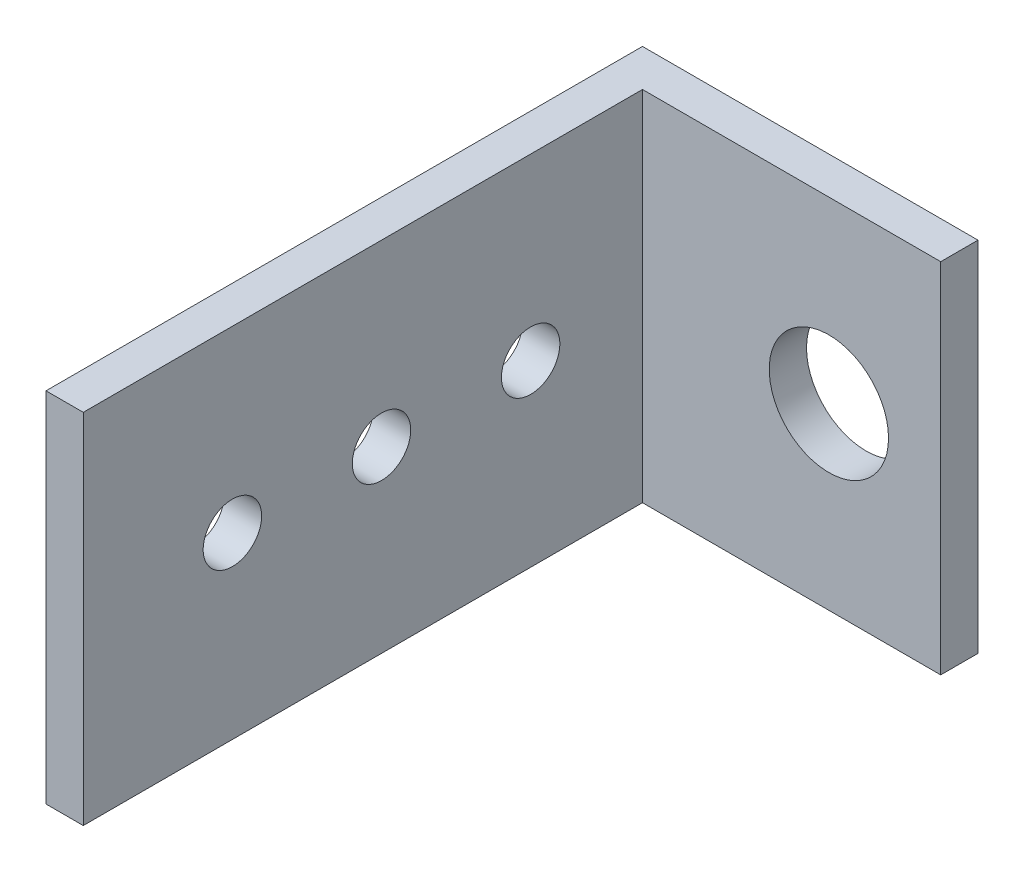
ISO-10303-21;
HEADER;
FILE_DESCRIPTION(('STEP AP214'),'2;1');
FILE_NAME('part.step','',(''),(''),'','','');
FILE_SCHEMA(('AUTOMOTIVE_DESIGN { 1 0 10303 214 1 1 1 1 }'));
ENDSEC;
DATA;
#1=APPLICATION_CONTEXT('core data for automotive mechanical design processes');
#2=APPLICATION_PROTOCOL_DEFINITION('international standard','automotive_design',2000,#1);
#3=PRODUCT_CONTEXT('',#1,'mechanical');
#4=PRODUCT('Part','Part','',(#3));
#5=PRODUCT_RELATED_PRODUCT_CATEGORY('part','',(#4));
#6=PRODUCT_DEFINITION_FORMATION('','',#4);
#7=PRODUCT_DEFINITION_CONTEXT('part definition',#1,'design');
#8=PRODUCT_DEFINITION('design','',#6,#7);
#9=PRODUCT_DEFINITION_SHAPE('','',#8);
#10=(LENGTH_UNIT() NAMED_UNIT(*) SI_UNIT(.MILLI.,.METRE.));
#11=(NAMED_UNIT(*) PLANE_ANGLE_UNIT() SI_UNIT($,.RADIAN.));
#12=(NAMED_UNIT(*) SI_UNIT($,.STERADIAN.) SOLID_ANGLE_UNIT());
#13=UNCERTAINTY_MEASURE_WITH_UNIT(LENGTH_MEASURE(1.E-05),#10,'distance_accuracy_value','');
#14=(GEOMETRIC_REPRESENTATION_CONTEXT(3) GLOBAL_UNCERTAINTY_ASSIGNED_CONTEXT((#13)) GLOBAL_UNIT_ASSIGNED_CONTEXT((#10,
#11,#12)) REPRESENTATION_CONTEXT('',''));
#15=CARTESIAN_POINT('',(0.,0.,0.));
#16=DIRECTION('',(0.,0.,1.));
#17=DIRECTION('',(1.,0.,0.));
#18=AXIS2_PLACEMENT_3D('',#15,#16,#17);
#19=CARTESIAN_POINT('',(3.175,30.48,0.));
#20=DIRECTION('',(-1.,0.,0.));
#21=DIRECTION('',(0.,0.,1.));
#22=AXIS2_PLACEMENT_3D('',#19,#20,#21);
#23=PLANE('',#22);
#24=CARTESIAN_POINT('',(3.175,15.24,-12.7));
#25=DIRECTION('',(1.,0.,0.));
#26=DIRECTION('',(0.,0.,-1.));
#27=AXIS2_PLACEMENT_3D('',#24,#25,#26);
#28=CIRCLE('',#27,2.4892);
#29=CARTESIAN_POINT('',(3.175,15.24,-15.1892));
#30=VERTEX_POINT('',#29);
#31=EDGE_CURVE('E175',#30,#30,#28,.T.);
#32=ORIENTED_EDGE('',*,*,#31,.F.);
#33=EDGE_LOOP('',(#32));
#34=FACE_BOUND('',#33,.T.);
#35=CARTESIAN_POINT('',(3.175,15.24,-25.4));
#36=DIRECTION('',(1.,0.,0.));
#37=DIRECTION('',(0.,0.,-1.));
#38=AXIS2_PLACEMENT_3D('',#35,#36,#37);
#39=CIRCLE('',#38,2.4892);
#40=CARTESIAN_POINT('',(3.175,15.24,-27.8892));
#41=VERTEX_POINT('',#40);
#42=EDGE_CURVE('E232',#41,#41,#39,.T.);
#43=ORIENTED_EDGE('',*,*,#42,.F.);
#44=EDGE_LOOP('',(#43));
#45=FACE_BOUND('',#44,.T.);
#46=CARTESIAN_POINT('',(3.175,15.24,-38.1));
#47=DIRECTION('',(1.,0.,0.));
#48=DIRECTION('',(0.,0.,-1.));
#49=AXIS2_PLACEMENT_3D('',#46,#47,#48);
#50=CIRCLE('',#49,2.4892);
#51=CARTESIAN_POINT('',(3.175,15.24,-40.5892));
#52=VERTEX_POINT('',#51);
#53=EDGE_CURVE('E191',#52,#52,#50,.T.);
#54=ORIENTED_EDGE('',*,*,#53,.F.);
#55=EDGE_LOOP('',(#54));
#56=FACE_BOUND('',#55,.T.);
#57=DIRECTION('',(0.,0.,-1.));
#58=VECTOR('',#57,1.);
#59=CARTESIAN_POINT('',(3.175,0.,0.));
#60=LINE('',#59,#58);
#61=CARTESIAN_POINT('',(3.175,0.,0.));
#62=VERTEX_POINT('',#61);
#63=CARTESIAN_POINT('',(3.175,0.,-47.625));
#64=VERTEX_POINT('',#63);
#65=EDGE_CURVE('E138',#62,#64,#60,.T.);
#66=ORIENTED_EDGE('',*,*,#65,.T.);
#67=DIRECTION('',(0.,-1.,0.));
#68=VECTOR('',#67,1.);
#69=CARTESIAN_POINT('',(3.175,30.48,-47.625));
#70=LINE('',#69,#68);
#71=CARTESIAN_POINT('',(3.175,30.48,-47.625));
#72=VERTEX_POINT('',#71);
#73=EDGE_CURVE('E11',#72,#64,#70,.T.);
#74=ORIENTED_EDGE('',*,*,#73,.F.);
#75=DIRECTION('',(0.,0.,-1.));
#76=VECTOR('',#75,1.);
#77=CARTESIAN_POINT('',(3.175,30.48,0.));
#78=LINE('',#77,#76);
#79=CARTESIAN_POINT('',(3.175,30.48,0.));
#80=VERTEX_POINT('',#79);
#81=EDGE_CURVE('E158',#80,#72,#78,.T.);
#82=ORIENTED_EDGE('',*,*,#81,.F.);
#83=DIRECTION('',(0.,-1.,0.));
#84=VECTOR('',#83,1.);
#85=CARTESIAN_POINT('',(3.175,30.48,0.));
#86=LINE('',#85,#84);
#87=EDGE_CURVE('E134',#80,#62,#86,.T.);
#88=ORIENTED_EDGE('',*,*,#87,.T.);
#89=EDGE_LOOP('',(#66,#74,#82,#88));
#90=FACE_BOUND('',#89,.T.);
#91=ADVANCED_FACE('F49',(#34,#45,#56,#90),#23,.F.);
#92=CARTESIAN_POINT('',(0.,30.48,-47.625));
#93=DIRECTION('',(0.,0.,-1.));
#94=DIRECTION('',(-1.,0.,0.));
#95=AXIS2_PLACEMENT_3D('',#92,#93,#94);
#96=PLANE('',#95);
#97=CARTESIAN_POINT('',(19.05,15.24,-47.625));
#98=DIRECTION('',(0.,0.,1.));
#99=DIRECTION('',(1.,0.,0.));
#100=AXIS2_PLACEMENT_3D('',#97,#98,#99);
#101=CIRCLE('',#100,5.08);
#102=CARTESIAN_POINT('',(24.13,15.24,-47.625));
#103=VERTEX_POINT('',#102);
#104=EDGE_CURVE('E170',#103,#103,#101,.T.);
#105=ORIENTED_EDGE('',*,*,#104,.F.);
#106=EDGE_LOOP('',(#105));
#107=FACE_BOUND('',#106,.T.);
#108=DIRECTION('',(1.,0.,0.));
#109=VECTOR('',#108,1.);
#110=CARTESIAN_POINT('',(0.,0.,-47.625));
#111=LINE('',#110,#109);
#112=CARTESIAN_POINT('',(28.575,0.,-47.625));
#113=VERTEX_POINT('',#112);
#114=EDGE_CURVE('E142',#64,#113,#111,.T.);
#115=ORIENTED_EDGE('',*,*,#114,.T.);
#116=DIRECTION('',(0.,-1.,0.));
#117=VECTOR('',#116,1.);
#118=CARTESIAN_POINT('',(28.575,30.48,-47.625));
#119=LINE('',#118,#117);
#120=CARTESIAN_POINT('',(28.575,30.48,-47.625));
#121=VERTEX_POINT('',#120);
#122=EDGE_CURVE('E59',#121,#113,#119,.T.);
#123=ORIENTED_EDGE('',*,*,#122,.F.);
#124=DIRECTION('',(1.,0.,0.));
#125=VECTOR('',#124,1.);
#126=CARTESIAN_POINT('',(0.,30.48,-47.625));
#127=LINE('',#126,#125);
#128=EDGE_CURVE('E101',#72,#121,#127,.T.);
#129=ORIENTED_EDGE('',*,*,#128,.F.);
#130=ORIENTED_EDGE('',*,*,#73,.T.);
#131=EDGE_LOOP('',(#115,#123,#129,#130));
#132=FACE_BOUND('',#131,.T.);
#133=ADVANCED_FACE('F219',(#107,#132),#96,.F.);
#134=CARTESIAN_POINT('',(28.5750000000001,30.48,0.));
#135=DIRECTION('',(1.,0.,0.));
#136=DIRECTION('',(0.,0.,-1.));
#137=AXIS2_PLACEMENT_3D('',#134,#135,#136);
#138=PLANE('',#137);
#139=DIRECTION('',(0.,0.,1.));
#140=VECTOR('',#139,1.);
#141=CARTESIAN_POINT('',(28.5750000000001,0.,0.));
#142=LINE('',#141,#140);
#143=CARTESIAN_POINT('',(28.575,0.,-50.8));
#144=VERTEX_POINT('',#143);
#145=EDGE_CURVE('E147',#144,#113,#142,.T.);
#146=ORIENTED_EDGE('',*,*,#145,.F.);
#147=DIRECTION('',(0.,-1.,0.));
#148=VECTOR('',#147,1.);
#149=CARTESIAN_POINT('',(28.575,30.48,-50.8));
#150=LINE('',#149,#148);
#151=CARTESIAN_POINT('',(28.575,30.48,-50.8));
#152=VERTEX_POINT('',#151);
#153=EDGE_CURVE('E121',#152,#144,#150,.T.);
#154=ORIENTED_EDGE('',*,*,#153,.F.);
#155=DIRECTION('',(0.,0.,1.));
#156=VECTOR('',#155,1.);
#157=CARTESIAN_POINT('',(28.5750000000001,30.48,0.));
#158=LINE('',#157,#156);
#159=EDGE_CURVE('E127',#152,#121,#158,.T.);
#160=ORIENTED_EDGE('',*,*,#159,.T.);
#161=ORIENTED_EDGE('',*,*,#122,.T.);
#162=EDGE_LOOP('',(#146,#154,#160,#161));
#163=FACE_BOUND('',#162,.T.);
#164=ADVANCED_FACE('F199',(#163),#138,.T.);
#165=CARTESIAN_POINT('',(0.,30.48,-50.8));
#166=DIRECTION('',(0.,0.,-1.));
#167=DIRECTION('',(-1.,0.,0.));
#168=AXIS2_PLACEMENT_3D('',#165,#166,#167);
#169=PLANE('',#168);
#170=CARTESIAN_POINT('',(19.05,15.24,-50.8));
#171=DIRECTION('',(0.,0.,-1.));
#172=DIRECTION('',(-1.,0.,0.));
#173=AXIS2_PLACEMENT_3D('',#170,#171,#172);
#174=CIRCLE('',#173,5.08);
#175=CARTESIAN_POINT('',(13.97,15.24,-50.8));
#176=VERTEX_POINT('',#175);
#177=EDGE_CURVE('E143',#176,#176,#174,.T.);
#178=ORIENTED_EDGE('',*,*,#177,.F.);
#179=EDGE_LOOP('',(#178));
#180=FACE_BOUND('',#179,.T.);
#181=DIRECTION('',(1.,0.,0.));
#182=VECTOR('',#181,1.);
#183=CARTESIAN_POINT('',(0.,0.,-50.8));
#184=LINE('',#183,#182);
#185=CARTESIAN_POINT('',(0.,0.,-50.8));
#186=VERTEX_POINT('',#185);
#187=EDGE_CURVE('E115',#186,#144,#184,.T.);
#188=ORIENTED_EDGE('',*,*,#187,.F.);
#189=DIRECTION('',(0.,-1.,0.));
#190=VECTOR('',#189,1.);
#191=CARTESIAN_POINT('',(0.,30.48,-50.8));
#192=LINE('',#191,#190);
#193=CARTESIAN_POINT('',(0.,30.48,-50.8));
#194=VERTEX_POINT('',#193);
#195=EDGE_CURVE('E110',#194,#186,#192,.T.);
#196=ORIENTED_EDGE('',*,*,#195,.F.);
#197=DIRECTION('',(1.,0.,0.));
#198=VECTOR('',#197,1.);
#199=CARTESIAN_POINT('',(0.,30.48,-50.8));
#200=LINE('',#199,#198);
#201=EDGE_CURVE('E113',#194,#152,#200,.T.);
#202=ORIENTED_EDGE('',*,*,#201,.T.);
#203=ORIENTED_EDGE('',*,*,#153,.T.);
#204=EDGE_LOOP('',(#188,#196,#202,#203));
#205=FACE_BOUND('',#204,.T.);
#206=ADVANCED_FACE('F112',(#180,#205),#169,.T.);
#207=CARTESIAN_POINT('',(0.,30.48,0.));
#208=DIRECTION('',(-1.,0.,0.));
#209=DIRECTION('',(0.,0.,1.));
#210=AXIS2_PLACEMENT_3D('',#207,#208,#209);
#211=PLANE('',#210);
#212=CARTESIAN_POINT('',(0.,15.24,-12.7));
#213=DIRECTION('',(-1.,0.,0.));
#214=DIRECTION('',(0.,0.,1.));
#215=AXIS2_PLACEMENT_3D('',#212,#213,#214);
#216=CIRCLE('',#215,2.4892);
#217=CARTESIAN_POINT('',(0.,15.24,-10.2108));
#218=VERTEX_POINT('',#217);
#219=EDGE_CURVE('E52',#218,#218,#216,.T.);
#220=ORIENTED_EDGE('',*,*,#219,.F.);
#221=EDGE_LOOP('',(#220));
#222=FACE_BOUND('',#221,.T.);
#223=CARTESIAN_POINT('',(0.,15.24,-25.4));
#224=DIRECTION('',(-1.,0.,0.));
#225=DIRECTION('',(0.,0.,1.));
#226=AXIS2_PLACEMENT_3D('',#223,#224,#225);
#227=CIRCLE('',#226,2.4892);
#228=CARTESIAN_POINT('',(0.,15.24,-22.9108));
#229=VERTEX_POINT('',#228);
#230=EDGE_CURVE('E174',#229,#229,#227,.T.);
#231=ORIENTED_EDGE('',*,*,#230,.F.);
#232=EDGE_LOOP('',(#231));
#233=FACE_BOUND('',#232,.T.);
#234=CARTESIAN_POINT('',(0.,15.24,-38.1));
#235=DIRECTION('',(-1.,0.,0.));
#236=DIRECTION('',(0.,0.,1.));
#237=AXIS2_PLACEMENT_3D('',#234,#235,#236);
#238=CIRCLE('',#237,2.4892);
#239=CARTESIAN_POINT('',(0.,15.24,-35.6108));
#240=VERTEX_POINT('',#239);
#241=EDGE_CURVE('E171',#240,#240,#238,.T.);
#242=ORIENTED_EDGE('',*,*,#241,.F.);
#243=EDGE_LOOP('',(#242));
#244=FACE_BOUND('',#243,.T.);
#245=DIRECTION('',(0.,0.,-1.));
#246=VECTOR('',#245,1.);
#247=CARTESIAN_POINT('',(0.,0.,0.));
#248=LINE('',#247,#246);
#249=CARTESIAN_POINT('',(0.,0.,0.));
#250=VERTEX_POINT('',#249);
#251=EDGE_CURVE('E153',#250,#186,#248,.T.);
#252=ORIENTED_EDGE('',*,*,#251,.F.);
#253=DIRECTION('',(0.,-1.,0.));
#254=VECTOR('',#253,1.);
#255=CARTESIAN_POINT('',(0.,30.48,0.));
#256=LINE('',#255,#254);
#257=CARTESIAN_POINT('',(0.,30.48,0.));
#258=VERTEX_POINT('',#257);
#259=EDGE_CURVE('E90',#258,#250,#256,.T.);
#260=ORIENTED_EDGE('',*,*,#259,.F.);
#261=DIRECTION('',(0.,0.,-1.));
#262=VECTOR('',#261,1.);
#263=CARTESIAN_POINT('',(0.,30.48,0.));
#264=LINE('',#263,#262);
#265=EDGE_CURVE('E125',#258,#194,#264,.T.);
#266=ORIENTED_EDGE('',*,*,#265,.T.);
#267=ORIENTED_EDGE('',*,*,#195,.T.);
#268=EDGE_LOOP('',(#252,#260,#266,#267));
#269=FACE_BOUND('',#268,.T.);
#270=ADVANCED_FACE('F130',(#222,#233,#244,#269),#211,.T.);
#271=CARTESIAN_POINT('',(0.,30.48,0.));
#272=DIRECTION('',(0.,0.,-1.));
#273=DIRECTION('',(-1.,0.,0.));
#274=AXIS2_PLACEMENT_3D('',#271,#272,#273);
#275=PLANE('',#274);
#276=DIRECTION('',(1.,0.,0.));
#277=VECTOR('',#276,1.);
#278=CARTESIAN_POINT('',(0.,0.,0.));
#279=LINE('',#278,#277);
#280=EDGE_CURVE('E93',#250,#62,#279,.T.);
#281=ORIENTED_EDGE('',*,*,#280,.T.);
#282=ORIENTED_EDGE('',*,*,#87,.F.);
#283=DIRECTION('',(1.,0.,0.));
#284=VECTOR('',#283,1.);
#285=CARTESIAN_POINT('',(0.,30.48,0.));
#286=LINE('',#285,#284);
#287=EDGE_CURVE('E68',#258,#80,#286,.T.);
#288=ORIENTED_EDGE('',*,*,#287,.F.);
#289=ORIENTED_EDGE('',*,*,#259,.T.);
#290=EDGE_LOOP('',(#281,#282,#288,#289));
#291=FACE_BOUND('',#290,.T.);
#292=ADVANCED_FACE('F206',(#291),#275,.F.);
#293=CARTESIAN_POINT('',(0.,30.48,0.));
#294=DIRECTION('',(0.,1.,0.));
#295=DIRECTION('',(0.,0.,1.));
#296=AXIS2_PLACEMENT_3D('',#293,#294,#295);
#297=PLANE('',#296);
#298=ORIENTED_EDGE('',*,*,#81,.T.);
#299=ORIENTED_EDGE('',*,*,#128,.T.);
#300=ORIENTED_EDGE('',*,*,#159,.F.);
#301=ORIENTED_EDGE('',*,*,#201,.F.);
#302=ORIENTED_EDGE('',*,*,#265,.F.);
#303=ORIENTED_EDGE('',*,*,#287,.T.);
#304=EDGE_LOOP('',(#298,#299,#300,#301,#302,#303));
#305=FACE_BOUND('',#304,.T.);
#306=ADVANCED_FACE('F124',(#305),#297,.T.);
#307=CARTESIAN_POINT('',(0.,0.,0.));
#308=DIRECTION('',(0.,1.,0.));
#309=DIRECTION('',(0.,0.,1.));
#310=AXIS2_PLACEMENT_3D('',#307,#308,#309);
#311=PLANE('',#310);
#312=ORIENTED_EDGE('',*,*,#65,.F.);
#313=ORIENTED_EDGE('',*,*,#280,.F.);
#314=ORIENTED_EDGE('',*,*,#251,.T.);
#315=ORIENTED_EDGE('',*,*,#187,.T.);
#316=ORIENTED_EDGE('',*,*,#145,.T.);
#317=ORIENTED_EDGE('',*,*,#114,.F.);
#318=EDGE_LOOP('',(#312,#313,#314,#315,#316,#317));
#319=FACE_BOUND('',#318,.T.);
#320=ADVANCED_FACE('F202',(#319),#311,.F.);
#321=CARTESIAN_POINT('',(19.05,15.24,-80.391));
#322=DIRECTION('',(0.,0.,1.));
#323=DIRECTION('',(1.,0.,0.));
#324=AXIS2_PLACEMENT_3D('',#321,#322,#323);
#325=CYLINDRICAL_SURFACE('',#324,5.08);
#326=ORIENTED_EDGE('',*,*,#177,.T.);
#327=EDGE_LOOP('',(#326));
#328=FACE_BOUND('',#327,.T.);
#329=ORIENTED_EDGE('',*,*,#104,.T.);
#330=EDGE_LOOP('',(#329));
#331=FACE_BOUND('',#330,.T.);
#332=ADVANCED_FACE('F254',(#328,#331),#325,.F.);
#333=CARTESIAN_POINT('',(-29.591,15.24,-38.1));
#334=DIRECTION('',(1.,0.,0.));
#335=DIRECTION('',(0.,0.,-1.));
#336=AXIS2_PLACEMENT_3D('',#333,#334,#335);
#337=CYLINDRICAL_SURFACE('',#336,2.4892);
#338=ORIENTED_EDGE('',*,*,#241,.T.);
#339=EDGE_LOOP('',(#338));
#340=FACE_BOUND('',#339,.T.);
#341=ORIENTED_EDGE('',*,*,#53,.T.);
#342=EDGE_LOOP('',(#341));
#343=FACE_BOUND('',#342,.T.);
#344=ADVANCED_FACE('F249',(#340,#343),#337,.F.);
#345=CARTESIAN_POINT('',(-29.591,15.24,-25.4));
#346=DIRECTION('',(1.,0.,0.));
#347=DIRECTION('',(0.,0.,-1.));
#348=AXIS2_PLACEMENT_3D('',#345,#346,#347);
#349=CYLINDRICAL_SURFACE('',#348,2.4892);
#350=ORIENTED_EDGE('',*,*,#230,.T.);
#351=EDGE_LOOP('',(#350));
#352=FACE_BOUND('',#351,.T.);
#353=ORIENTED_EDGE('',*,*,#42,.T.);
#354=EDGE_LOOP('',(#353));
#355=FACE_BOUND('',#354,.T.);
#356=ADVANCED_FACE('F244',(#352,#355),#349,.F.);
#357=CARTESIAN_POINT('',(-29.591,15.24,-12.7));
#358=DIRECTION('',(1.,0.,0.));
#359=DIRECTION('',(0.,0.,-1.));
#360=AXIS2_PLACEMENT_3D('',#357,#358,#359);
#361=CYLINDRICAL_SURFACE('',#360,2.4892);
#362=ORIENTED_EDGE('',*,*,#219,.T.);
#363=EDGE_LOOP('',(#362));
#364=FACE_BOUND('',#363,.T.);
#365=ORIENTED_EDGE('',*,*,#31,.T.);
#366=EDGE_LOOP('',(#365));
#367=FACE_BOUND('',#366,.T.);
#368=ADVANCED_FACE('F242',(#364,#367),#361,.F.);
#369=CLOSED_SHELL('',(#91,#133,#164,#206,#270,#292,#306,#320,#332,#344,#356,#368));
#370=MANIFOLD_SOLID_BREP('B2',#369);
#371=ADVANCED_BREP_SHAPE_REPRESENTATION('',(#18,#370),#14);
#372=SHAPE_DEFINITION_REPRESENTATION(#9,#371);
ENDSEC;
END-ISO-10303-21;
